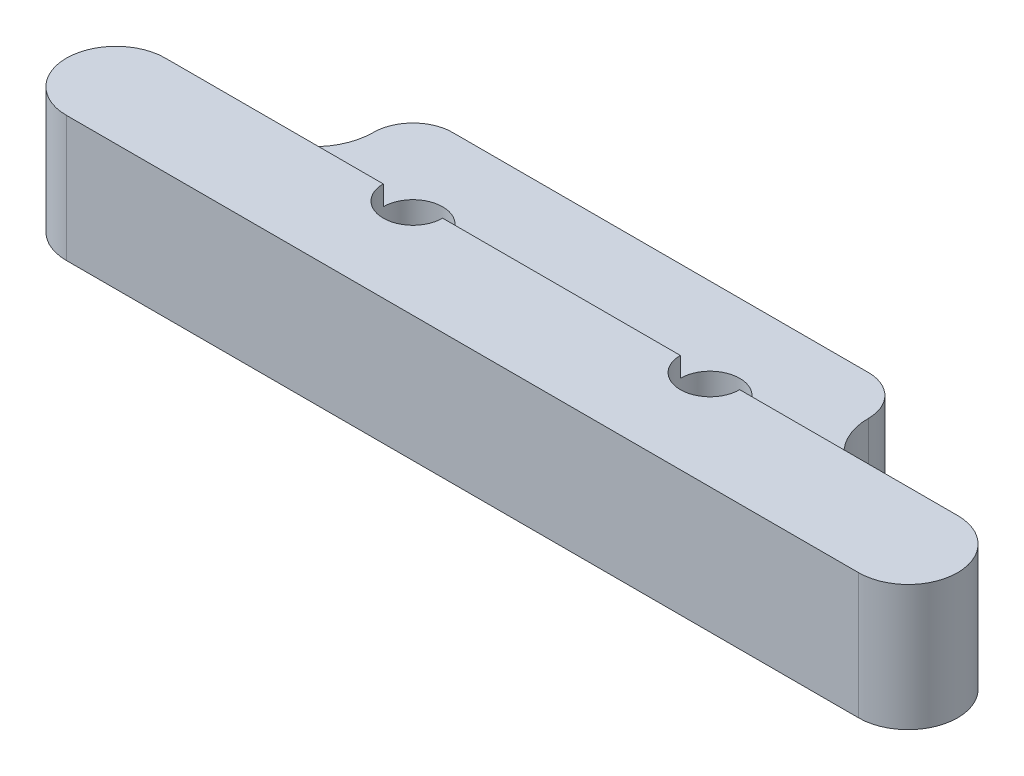
ISO-10303-21;
HEADER;
FILE_DESCRIPTION(('STEP AP214'),'2;1');
FILE_NAME('part.step','',(''),(''),'','','');
FILE_SCHEMA(('AUTOMOTIVE_DESIGN { 1 0 10303 214 1 1 1 1 }'));
ENDSEC;
DATA;
#1=APPLICATION_CONTEXT('core data for automotive mechanical design processes');
#2=APPLICATION_PROTOCOL_DEFINITION('international standard','automotive_design',2000,#1);
#3=PRODUCT_CONTEXT('',#1,'mechanical');
#4=PRODUCT('Part','Part','',(#3));
#5=PRODUCT_RELATED_PRODUCT_CATEGORY('part','',(#4));
#6=PRODUCT_DEFINITION_FORMATION('','',#4);
#7=PRODUCT_DEFINITION_CONTEXT('part definition',#1,'design');
#8=PRODUCT_DEFINITION('design','',#6,#7);
#9=PRODUCT_DEFINITION_SHAPE('','',#8);
#10=(LENGTH_UNIT() NAMED_UNIT(*) SI_UNIT(.MILLI.,.METRE.));
#11=(NAMED_UNIT(*) PLANE_ANGLE_UNIT() SI_UNIT($,.RADIAN.));
#12=(NAMED_UNIT(*) SI_UNIT($,.STERADIAN.) SOLID_ANGLE_UNIT());
#13=UNCERTAINTY_MEASURE_WITH_UNIT(LENGTH_MEASURE(1.E-05),#10,'distance_accuracy_value','');
#14=(GEOMETRIC_REPRESENTATION_CONTEXT(3) GLOBAL_UNCERTAINTY_ASSIGNED_CONTEXT((#13)) GLOBAL_UNIT_ASSIGNED_CONTEXT((#10,
#11,#12)) REPRESENTATION_CONTEXT('',''));
#15=CARTESIAN_POINT('',(0.,0.,0.));
#16=DIRECTION('',(0.,0.,1.));
#17=DIRECTION('',(1.,0.,0.));
#18=AXIS2_PLACEMENT_3D('',#15,#16,#17);
#19=CARTESIAN_POINT('',(10.5,6.35,-5.5));
#20=DIRECTION('',(0.,-1.,0.));
#21=DIRECTION('',(0.,0.,-1.));
#22=AXIS2_PLACEMENT_3D('',#19,#20,#21);
#23=CYLINDRICAL_SURFACE('',#22,2.);
#24=DIRECTION('',(0.,-1.,0.));
#25=VECTOR('',#24,1.);
#26=CARTESIAN_POINT('',(10.5,6.35,-7.5));
#27=LINE('',#26,#25);
#28=CARTESIAN_POINT('',(10.5,5.35,-7.5));
#29=VERTEX_POINT('',#28);
#30=CARTESIAN_POINT('',(10.5,0.,-7.5));
#31=VERTEX_POINT('',#30);
#32=EDGE_CURVE('E167',#29,#31,#27,.T.);
#33=ORIENTED_EDGE('',*,*,#32,.F.);
#34=CARTESIAN_POINT('',(10.5,5.35,-5.5));
#35=DIRECTION('',(0.,1.,0.));
#36=DIRECTION('',(0.,0.,1.));
#37=AXIS2_PLACEMENT_3D('',#34,#35,#36);
#38=CIRCLE('',#37,2.);
#39=CARTESIAN_POINT('',(12.5,5.35,-5.5));
#40=VERTEX_POINT('',#39);
#41=EDGE_CURVE('E234',#40,#29,#38,.T.);
#42=ORIENTED_EDGE('',*,*,#41,.F.);
#43=DIRECTION('',(0.,-1.,0.));
#44=VECTOR('',#43,1.);
#45=CARTESIAN_POINT('',(12.5,6.35,-5.5));
#46=LINE('',#45,#44);
#47=CARTESIAN_POINT('',(12.5,0.,-5.5));
#48=VERTEX_POINT('',#47);
#49=EDGE_CURVE('E165',#40,#48,#46,.T.);
#50=ORIENTED_EDGE('',*,*,#49,.T.);
#51=CARTESIAN_POINT('',(10.5,0.,-5.5));
#52=DIRECTION('',(0.,1.,0.));
#53=DIRECTION('',(0.,0.,1.));
#54=AXIS2_PLACEMENT_3D('',#51,#52,#53);
#55=CIRCLE('',#54,2.);
#56=EDGE_CURVE('E189',#31,#48,#55,.F.);
#57=ORIENTED_EDGE('',*,*,#56,.F.);
#58=EDGE_LOOP('',(#33,#42,#50,#57));
#59=FACE_BOUND('',#58,.T.);
#60=ADVANCED_FACE('F36',(#59),#23,.T.);
#61=CARTESIAN_POINT('',(0.,6.35,-7.5));
#62=DIRECTION('',(0.,0.,-1.));
#63=DIRECTION('',(-1.,0.,0.));
#64=AXIS2_PLACEMENT_3D('',#61,#62,#63);
#65=PLANE('',#64);
#66=DIRECTION('',(0.,-1.,0.));
#67=VECTOR('',#66,1.);
#68=CARTESIAN_POINT('',(-10.5,6.35,-7.5));
#69=LINE('',#68,#67);
#70=CARTESIAN_POINT('',(-10.5,5.35,-7.5));
#71=VERTEX_POINT('',#70);
#72=CARTESIAN_POINT('',(-10.5,0.,-7.5));
#73=VERTEX_POINT('',#72);
#74=EDGE_CURVE('E169',#71,#73,#69,.T.);
#75=ORIENTED_EDGE('',*,*,#74,.F.);
#76=DIRECTION('',(-1.,0.,0.));
#77=VECTOR('',#76,1.);
#78=CARTESIAN_POINT('',(0.,5.35,-7.5));
#79=LINE('',#78,#77);
#80=EDGE_CURVE('E232',#29,#71,#79,.T.);
#81=ORIENTED_EDGE('',*,*,#80,.F.);
#82=ORIENTED_EDGE('',*,*,#32,.T.);
#83=DIRECTION('',(1.,0.,0.));
#84=VECTOR('',#83,1.);
#85=CARTESIAN_POINT('',(0.,0.,-7.5));
#86=LINE('',#85,#84);
#87=EDGE_CURVE('E186',#73,#31,#86,.T.);
#88=ORIENTED_EDGE('',*,*,#87,.F.);
#89=EDGE_LOOP('',(#75,#81,#82,#88));
#90=FACE_BOUND('',#89,.T.);
#91=ADVANCED_FACE('F266',(#90),#65,.T.);
#92=CARTESIAN_POINT('',(-10.5,6.35,-5.5));
#93=DIRECTION('',(0.,-1.,0.));
#94=DIRECTION('',(0.,0.,-1.));
#95=AXIS2_PLACEMENT_3D('',#92,#93,#94);
#96=CYLINDRICAL_SURFACE('',#95,2.);
#97=DIRECTION('',(0.,-1.,0.));
#98=VECTOR('',#97,1.);
#99=CARTESIAN_POINT('',(-12.5,6.35,-5.5));
#100=LINE('',#99,#98);
#101=CARTESIAN_POINT('',(-12.5,5.35,-5.5));
#102=VERTEX_POINT('',#101);
#103=CARTESIAN_POINT('',(-12.5,0.,-5.5));
#104=VERTEX_POINT('',#103);
#105=EDGE_CURVE('E171',#102,#104,#100,.T.);
#106=ORIENTED_EDGE('',*,*,#105,.F.);
#107=CARTESIAN_POINT('',(-10.5,5.35,-5.5));
#108=DIRECTION('',(0.,1.,0.));
#109=DIRECTION('',(0.,0.,1.));
#110=AXIS2_PLACEMENT_3D('',#107,#108,#109);
#111=CIRCLE('',#110,2.);
#112=EDGE_CURVE('E51',#71,#102,#111,.T.);
#113=ORIENTED_EDGE('',*,*,#112,.F.);
#114=ORIENTED_EDGE('',*,*,#74,.T.);
#115=CARTESIAN_POINT('',(-10.5,0.,-5.5));
#116=DIRECTION('',(0.,1.,0.));
#117=DIRECTION('',(0.,0.,1.));
#118=AXIS2_PLACEMENT_3D('',#115,#116,#117);
#119=CIRCLE('',#118,2.);
#120=EDGE_CURVE('E183',#104,#73,#119,.F.);
#121=ORIENTED_EDGE('',*,*,#120,.F.);
#122=EDGE_LOOP('',(#106,#113,#114,#121));
#123=FACE_BOUND('',#122,.T.);
#124=ADVANCED_FACE('F269',(#123),#96,.T.);
#125=CARTESIAN_POINT('',(15.5,6.35,-5.5));
#126=DIRECTION('',(0.,1.,0.));
#127=DIRECTION('',(0.,0.,1.));
#128=AXIS2_PLACEMENT_3D('',#125,#126,#127);
#129=CYLINDRICAL_SURFACE('',#128,3.);
#130=CARTESIAN_POINT('',(15.5,5.35,-5.5));
#131=DIRECTION('',(0.,1.,0.));
#132=DIRECTION('',(0.,0.,1.));
#133=AXIS2_PLACEMENT_3D('',#130,#131,#132);
#134=CIRCLE('',#133,3.);
#135=CARTESIAN_POINT('',(15.5,5.35,-2.5));
#136=VERTEX_POINT('',#135);
#137=EDGE_CURVE('E236',#136,#40,#134,.F.);
#138=ORIENTED_EDGE('',*,*,#137,.F.);
#139=DIRECTION('',(0.,-1.,0.));
#140=VECTOR('',#139,1.);
#141=CARTESIAN_POINT('',(15.5,6.35,-2.5));
#142=LINE('',#141,#140);
#143=CARTESIAN_POINT('',(15.5,0.,-2.5));
#144=VERTEX_POINT('',#143);
#145=EDGE_CURVE('E154',#144,#136,#142,.F.);
#146=ORIENTED_EDGE('',*,*,#145,.F.);
#147=CARTESIAN_POINT('',(15.5,0.,-5.5));
#148=DIRECTION('',(0.,1.,0.));
#149=DIRECTION('',(0.,0.,1.));
#150=AXIS2_PLACEMENT_3D('',#147,#148,#149);
#151=CIRCLE('',#150,3.);
#152=EDGE_CURVE('E44',#48,#144,#151,.T.);
#153=ORIENTED_EDGE('',*,*,#152,.F.);
#154=ORIENTED_EDGE('',*,*,#49,.F.);
#155=EDGE_LOOP('',(#138,#146,#153,#154));
#156=FACE_BOUND('',#155,.T.);
#157=ADVANCED_FACE('F251',(#156),#129,.F.);
#158=CARTESIAN_POINT('',(-15.5,6.35,-5.5));
#159=DIRECTION('',(0.,1.,0.));
#160=DIRECTION('',(0.,0.,1.));
#161=AXIS2_PLACEMENT_3D('',#158,#159,#160);
#162=CYLINDRICAL_SURFACE('',#161,3.);
#163=CARTESIAN_POINT('',(-15.5,5.35,-5.5));
#164=DIRECTION('',(0.,1.,0.));
#165=DIRECTION('',(0.,0.,1.));
#166=AXIS2_PLACEMENT_3D('',#163,#164,#165);
#167=CIRCLE('',#166,3.);
#168=CARTESIAN_POINT('',(-15.5,5.35,-2.5));
#169=VERTEX_POINT('',#168);
#170=EDGE_CURVE('E144',#102,#169,#167,.F.);
#171=ORIENTED_EDGE('',*,*,#170,.F.);
#172=ORIENTED_EDGE('',*,*,#105,.T.);
#173=CARTESIAN_POINT('',(-15.5,0.,-5.5));
#174=DIRECTION('',(0.,1.,0.));
#175=DIRECTION('',(0.,0.,1.));
#176=AXIS2_PLACEMENT_3D('',#173,#174,#175);
#177=CIRCLE('',#176,3.);
#178=CARTESIAN_POINT('',(-15.5,0.,-2.5));
#179=VERTEX_POINT('',#178);
#180=EDGE_CURVE('E11',#179,#104,#177,.T.);
#181=ORIENTED_EDGE('',*,*,#180,.F.);
#182=DIRECTION('',(0.,-1.,0.));
#183=VECTOR('',#182,1.);
#184=CARTESIAN_POINT('',(-15.5,0.,-2.5));
#185=LINE('',#184,#183);
#186=EDGE_CURVE('E59',#169,#179,#185,.T.);
#187=ORIENTED_EDGE('',*,*,#186,.F.);
#188=EDGE_LOOP('',(#171,#172,#181,#187));
#189=FACE_BOUND('',#188,.T.);
#190=ADVANCED_FACE('F38',(#189),#162,.F.);
#191=CARTESIAN_POINT('',(0.,6.35,2.5));
#192=DIRECTION('',(0.,0.,-1.));
#193=DIRECTION('',(-1.,0.,0.));
#194=AXIS2_PLACEMENT_3D('',#191,#192,#193);
#195=PLANE('',#194);
#196=DIRECTION('',(1.,0.,0.));
#197=VECTOR('',#196,1.);
#198=CARTESIAN_POINT('',(0.,0.,2.5));
#199=LINE('',#198,#197);
#200=CARTESIAN_POINT('',(-20.,0.,2.5));
#201=VERTEX_POINT('',#200);
#202=CARTESIAN_POINT('',(20.,0.,2.5));
#203=VERTEX_POINT('',#202);
#204=EDGE_CURVE('E197',#201,#203,#199,.T.);
#205=ORIENTED_EDGE('',*,*,#204,.T.);
#206=DIRECTION('',(0.,-1.,0.));
#207=VECTOR('',#206,1.);
#208=CARTESIAN_POINT('',(20.,6.35,2.5));
#209=LINE('',#208,#207);
#210=CARTESIAN_POINT('',(20.,6.35,2.5));
#211=VERTEX_POINT('',#210);
#212=EDGE_CURVE('E157',#211,#203,#209,.T.);
#213=ORIENTED_EDGE('',*,*,#212,.F.);
#214=DIRECTION('',(1.,0.,0.));
#215=VECTOR('',#214,1.);
#216=CARTESIAN_POINT('',(0.,6.35,2.5));
#217=LINE('',#216,#215);
#218=CARTESIAN_POINT('',(-20.,6.35,2.5));
#219=VERTEX_POINT('',#218);
#220=EDGE_CURVE('E181',#219,#211,#217,.T.);
#221=ORIENTED_EDGE('',*,*,#220,.F.);
#222=DIRECTION('',(0.,-1.,0.));
#223=VECTOR('',#222,1.);
#224=CARTESIAN_POINT('',(-20.,6.35,2.5));
#225=LINE('',#224,#223);
#226=EDGE_CURVE('E175',#219,#201,#225,.T.);
#227=ORIENTED_EDGE('',*,*,#226,.T.);
#228=EDGE_LOOP('',(#205,#213,#221,#227));
#229=FACE_BOUND('',#228,.T.);
#230=ADVANCED_FACE('F294',(#229),#195,.F.);
#231=CARTESIAN_POINT('',(20.,6.35,0.));
#232=DIRECTION('',(0.,-1.,0.));
#233=DIRECTION('',(0.,0.,-1.));
#234=AXIS2_PLACEMENT_3D('',#231,#232,#233);
#235=CYLINDRICAL_SURFACE('',#234,2.5);
#236=CARTESIAN_POINT('',(20.,0.,0.));
#237=DIRECTION('',(0.,1.,0.));
#238=DIRECTION('',(0.,0.,1.));
#239=AXIS2_PLACEMENT_3D('',#236,#237,#238);
#240=CIRCLE('',#239,2.5);
#241=CARTESIAN_POINT('',(20.,0.,-2.5));
#242=VERTEX_POINT('',#241);
#243=EDGE_CURVE('E194',#203,#242,#240,.T.);
#244=ORIENTED_EDGE('',*,*,#243,.T.);
#245=DIRECTION('',(0.,-1.,0.));
#246=VECTOR('',#245,1.);
#247=CARTESIAN_POINT('',(20.,6.35,-2.5));
#248=LINE('',#247,#246);
#249=CARTESIAN_POINT('',(20.,6.35,-2.5));
#250=VERTEX_POINT('',#249);
#251=EDGE_CURVE('E162',#250,#242,#248,.T.);
#252=ORIENTED_EDGE('',*,*,#251,.F.);
#253=CARTESIAN_POINT('',(20.,6.35,0.));
#254=DIRECTION('',(0.,1.,0.));
#255=DIRECTION('',(0.,0.,1.));
#256=AXIS2_PLACEMENT_3D('',#253,#254,#255);
#257=CIRCLE('',#256,2.5);
#258=EDGE_CURVE('E205',#211,#250,#257,.T.);
#259=ORIENTED_EDGE('',*,*,#258,.F.);
#260=ORIENTED_EDGE('',*,*,#212,.T.);
#261=EDGE_LOOP('',(#244,#252,#259,#260));
#262=FACE_BOUND('',#261,.T.);
#263=ADVANCED_FACE('F292',(#262),#235,.T.);
#264=CARTESIAN_POINT('',(0.,6.35,-2.5));
#265=DIRECTION('',(0.,0.,-1.));
#266=DIRECTION('',(-1.,0.,0.));
#267=AXIS2_PLACEMENT_3D('',#264,#265,#266);
#268=PLANE('',#267);
#269=DIRECTION('',(1.,0.,0.));
#270=VECTOR('',#269,1.);
#271=CARTESIAN_POINT('',(0.,0.,-2.5));
#272=LINE('',#271,#270);
#273=EDGE_CURVE('E192',#144,#242,#272,.T.);
#274=ORIENTED_EDGE('',*,*,#273,.F.);
#275=ORIENTED_EDGE('',*,*,#145,.T.);
#276=DIRECTION('',(1.,0.,0.));
#277=VECTOR('',#276,1.);
#278=CARTESIAN_POINT('',(0.,5.35,-2.5));
#279=LINE('',#278,#277);
#280=CARTESIAN_POINT('',(9.,5.35,-2.5));
#281=VERTEX_POINT('',#280);
#282=EDGE_CURVE('E146',#281,#136,#279,.T.);
#283=ORIENTED_EDGE('',*,*,#282,.F.);
#284=DIRECTION('',(0.,1.,0.));
#285=VECTOR('',#284,1.);
#286=CARTESIAN_POINT('',(9.,5.35,-2.5));
#287=LINE('',#286,#285);
#288=CARTESIAN_POINT('',(9.,6.35,-2.5));
#289=VERTEX_POINT('',#288);
#290=EDGE_CURVE('E221',#281,#289,#287,.T.);
#291=ORIENTED_EDGE('',*,*,#290,.T.);
#292=DIRECTION('',(1.,0.,0.));
#293=VECTOR('',#292,1.);
#294=CARTESIAN_POINT('',(0.,6.35,-2.5));
#295=LINE('',#294,#293);
#296=EDGE_CURVE('E203',#289,#250,#295,.T.);
#297=ORIENTED_EDGE('',*,*,#296,.T.);
#298=ORIENTED_EDGE('',*,*,#251,.T.);
#299=EDGE_LOOP('',(#274,#275,#283,#291,#297,#298));
#300=FACE_BOUND('',#299,.T.);
#301=ADVANCED_FACE('F254',(#300),#268,.T.);
#302=CARTESIAN_POINT('',(-20.,6.35,-2.5));
#303=VERTEX_POINT('',#302);
#304=CARTESIAN_POINT('',(-9.,6.35,-2.5));
#305=VERTEX_POINT('',#304);
#306=EDGE_CURVE('E202',#303,#305,#295,.T.);
#307=ORIENTED_EDGE('',*,*,#306,.T.);
#308=DIRECTION('',(0.,1.,0.));
#309=VECTOR('',#308,1.);
#310=CARTESIAN_POINT('',(-9.,5.35,-2.5));
#311=LINE('',#310,#309);
#312=CARTESIAN_POINT('',(-9.,5.35,-2.5));
#313=VERTEX_POINT('',#312);
#314=EDGE_CURVE('E140',#313,#305,#311,.T.);
#315=ORIENTED_EDGE('',*,*,#314,.F.);
#316=EDGE_CURVE('E137',#169,#313,#279,.T.);
#317=ORIENTED_EDGE('',*,*,#316,.F.);
#318=ORIENTED_EDGE('',*,*,#186,.T.);
#319=CARTESIAN_POINT('',(-20.,0.,-2.5));
#320=VERTEX_POINT('',#319);
#321=EDGE_CURVE('E182',#320,#179,#272,.T.);
#322=ORIENTED_EDGE('',*,*,#321,.F.);
#323=DIRECTION('',(0.,-1.,0.));
#324=VECTOR('',#323,1.);
#325=CARTESIAN_POINT('',(-20.,6.35,-2.5));
#326=LINE('',#325,#324);
#327=EDGE_CURVE('E173',#303,#320,#326,.T.);
#328=ORIENTED_EDGE('',*,*,#327,.F.);
#329=EDGE_LOOP('',(#307,#315,#317,#318,#322,#328));
#330=FACE_BOUND('',#329,.T.);
#331=ADVANCED_FACE('F138',(#330),#268,.T.);
#332=CARTESIAN_POINT('',(-20.,6.35,0.));
#333=DIRECTION('',(0.,-1.,0.));
#334=DIRECTION('',(0.,0.,-1.));
#335=AXIS2_PLACEMENT_3D('',#332,#333,#334);
#336=CYLINDRICAL_SURFACE('',#335,2.5);
#337=CARTESIAN_POINT('',(-20.,0.,0.));
#338=DIRECTION('',(0.,1.,0.));
#339=DIRECTION('',(0.,0.,1.));
#340=AXIS2_PLACEMENT_3D('',#337,#338,#339);
#341=CIRCLE('',#340,2.5);
#342=EDGE_CURVE('E179',#320,#201,#341,.T.);
#343=ORIENTED_EDGE('',*,*,#342,.T.);
#344=ORIENTED_EDGE('',*,*,#226,.F.);
#345=CARTESIAN_POINT('',(-20.,6.35,0.));
#346=DIRECTION('',(0.,1.,0.));
#347=DIRECTION('',(0.,0.,1.));
#348=AXIS2_PLACEMENT_3D('',#345,#346,#347);
#349=CIRCLE('',#348,2.5);
#350=EDGE_CURVE('E178',#303,#219,#349,.T.);
#351=ORIENTED_EDGE('',*,*,#350,.F.);
#352=ORIENTED_EDGE('',*,*,#327,.T.);
#353=EDGE_LOOP('',(#343,#344,#351,#352));
#354=FACE_BOUND('',#353,.T.);
#355=ADVANCED_FACE('F275',(#354),#336,.T.);
#356=CARTESIAN_POINT('',(0.,6.35,0.));
#357=DIRECTION('',(0.,1.,0.));
#358=DIRECTION('',(0.,0.,1.));
#359=AXIS2_PLACEMENT_3D('',#356,#357,#358);
#360=PLANE('',#359);
#361=ORIENTED_EDGE('',*,*,#296,.F.);
#362=CARTESIAN_POINT('',(7.5,6.35,-2.5));
#363=DIRECTION('',(0.,1.,0.));
#364=DIRECTION('',(0.,0.,1.));
#365=AXIS2_PLACEMENT_3D('',#362,#363,#364);
#366=CIRCLE('',#365,1.5);
#367=CARTESIAN_POINT('',(6.,6.35,-2.5));
#368=VERTEX_POINT('',#367);
#369=EDGE_CURVE('E212',#368,#289,#366,.T.);
#370=ORIENTED_EDGE('',*,*,#369,.F.);
#371=DIRECTION('',(1.,0.,0.));
#372=VECTOR('',#371,1.);
#373=CARTESIAN_POINT('',(0.,6.35,-2.5));
#374=LINE('',#373,#372);
#375=CARTESIAN_POINT('',(-6.,6.35,-2.5));
#376=VERTEX_POINT('',#375);
#377=EDGE_CURVE('E151',#376,#368,#374,.T.);
#378=ORIENTED_EDGE('',*,*,#377,.F.);
#379=CARTESIAN_POINT('',(-7.5,6.35,-2.5));
#380=DIRECTION('',(0.,1.,0.));
#381=DIRECTION('',(0.,0.,1.));
#382=AXIS2_PLACEMENT_3D('',#379,#380,#381);
#383=CIRCLE('',#382,1.5);
#384=EDGE_CURVE('E218',#305,#376,#383,.T.);
#385=ORIENTED_EDGE('',*,*,#384,.F.);
#386=ORIENTED_EDGE('',*,*,#306,.F.);
#387=ORIENTED_EDGE('',*,*,#350,.T.);
#388=ORIENTED_EDGE('',*,*,#220,.T.);
#389=ORIENTED_EDGE('',*,*,#258,.T.);
#390=EDGE_LOOP('',(#361,#370,#378,#385,#386,#387,#388,#389));
#391=FACE_BOUND('',#390,.T.);
#392=ADVANCED_FACE('F279',(#391),#360,.T.);
#393=CARTESIAN_POINT('',(0.,0.,0.));
#394=DIRECTION('',(0.,1.,0.));
#395=DIRECTION('',(0.,0.,1.));
#396=AXIS2_PLACEMENT_3D('',#393,#394,#395);
#397=PLANE('',#396);
#398=CARTESIAN_POINT('',(-7.5,0.,-2.5));
#399=DIRECTION('',(0.,1.,0.));
#400=DIRECTION('',(0.,0.,1.));
#401=AXIS2_PLACEMENT_3D('',#398,#399,#400);
#402=CIRCLE('',#401,1.5);
#403=CARTESIAN_POINT('',(-7.5,0.,-1.));
#404=VERTEX_POINT('',#403);
#405=EDGE_CURVE('E215',#404,#404,#402,.T.);
#406=ORIENTED_EDGE('',*,*,#405,.T.);
#407=EDGE_LOOP('',(#406));
#408=FACE_BOUND('',#407,.T.);
#409=CARTESIAN_POINT('',(7.5,0.,-2.5));
#410=DIRECTION('',(0.,1.,0.));
#411=DIRECTION('',(0.,0.,1.));
#412=AXIS2_PLACEMENT_3D('',#409,#410,#411);
#413=CIRCLE('',#412,1.5);
#414=CARTESIAN_POINT('',(7.5,0.,-1.));
#415=VERTEX_POINT('',#414);
#416=EDGE_CURVE('E200',#415,#415,#413,.T.);
#417=ORIENTED_EDGE('',*,*,#416,.T.);
#418=EDGE_LOOP('',(#417));
#419=FACE_BOUND('',#418,.T.);
#420=ORIENTED_EDGE('',*,*,#204,.F.);
#421=ORIENTED_EDGE('',*,*,#342,.F.);
#422=ORIENTED_EDGE('',*,*,#321,.T.);
#423=ORIENTED_EDGE('',*,*,#180,.T.);
#424=ORIENTED_EDGE('',*,*,#120,.T.);
#425=ORIENTED_EDGE('',*,*,#87,.T.);
#426=ORIENTED_EDGE('',*,*,#56,.T.);
#427=ORIENTED_EDGE('',*,*,#152,.T.);
#428=ORIENTED_EDGE('',*,*,#273,.T.);
#429=ORIENTED_EDGE('',*,*,#243,.F.);
#430=EDGE_LOOP('',(#420,#421,#422,#423,#424,#425,#426,#427,#428,#429));
#431=FACE_BOUND('',#430,.T.);
#432=ADVANCED_FACE('F258',(#408,#419,#431),#397,.F.);
#433=CARTESIAN_POINT('',(7.5,6.35,-2.5));
#434=DIRECTION('',(0.,1.,0.));
#435=DIRECTION('',(0.,0.,1.));
#436=AXIS2_PLACEMENT_3D('',#433,#434,#435);
#437=CYLINDRICAL_SURFACE('',#436,1.5);
#438=ORIENTED_EDGE('',*,*,#369,.T.);
#439=ORIENTED_EDGE('',*,*,#290,.F.);
#440=CARTESIAN_POINT('',(7.5,5.35,-2.5));
#441=DIRECTION('',(0.,1.,0.));
#442=DIRECTION('',(0.,0.,1.));
#443=AXIS2_PLACEMENT_3D('',#440,#441,#442);
#444=CIRCLE('',#443,1.5);
#445=CARTESIAN_POINT('',(6.,5.35,-2.5));
#446=VERTEX_POINT('',#445);
#447=EDGE_CURVE('E238',#446,#281,#444,.F.);
#448=ORIENTED_EDGE('',*,*,#447,.F.);
#449=DIRECTION('',(0.,1.,0.));
#450=VECTOR('',#449,1.);
#451=CARTESIAN_POINT('',(6.,5.35,-2.5));
#452=LINE('',#451,#450);
#453=EDGE_CURVE('E225',#446,#368,#452,.T.);
#454=ORIENTED_EDGE('',*,*,#453,.T.);
#455=EDGE_LOOP('',(#438,#439,#448,#454));
#456=FACE_BOUND('',#455,.T.);
#457=ORIENTED_EDGE('',*,*,#416,.F.);
#458=EDGE_LOOP('',(#457));
#459=FACE_BOUND('',#458,.T.);
#460=ADVANCED_FACE('F288',(#456,#459),#437,.F.);
#461=CARTESIAN_POINT('',(-7.5,6.35,-2.5));
#462=DIRECTION('',(0.,1.,0.));
#463=DIRECTION('',(0.,0.,1.));
#464=AXIS2_PLACEMENT_3D('',#461,#462,#463);
#465=CYLINDRICAL_SURFACE('',#464,1.5);
#466=ORIENTED_EDGE('',*,*,#384,.T.);
#467=DIRECTION('',(0.,1.,0.));
#468=VECTOR('',#467,1.);
#469=CARTESIAN_POINT('',(-6.,5.35,-2.5));
#470=LINE('',#469,#468);
#471=CARTESIAN_POINT('',(-6.,5.35,-2.5));
#472=VERTEX_POINT('',#471);
#473=EDGE_CURVE('E223',#472,#376,#470,.T.);
#474=ORIENTED_EDGE('',*,*,#473,.F.);
#475=CARTESIAN_POINT('',(-7.5,5.35,-2.5));
#476=DIRECTION('',(0.,1.,0.));
#477=DIRECTION('',(0.,0.,1.));
#478=AXIS2_PLACEMENT_3D('',#475,#476,#477);
#479=CIRCLE('',#478,1.5);
#480=EDGE_CURVE('E143',#313,#472,#479,.F.);
#481=ORIENTED_EDGE('',*,*,#480,.F.);
#482=ORIENTED_EDGE('',*,*,#314,.T.);
#483=EDGE_LOOP('',(#466,#474,#481,#482));
#484=FACE_BOUND('',#483,.T.);
#485=ORIENTED_EDGE('',*,*,#405,.F.);
#486=EDGE_LOOP('',(#485));
#487=FACE_BOUND('',#486,.T.);
#488=ADVANCED_FACE('F283',(#484,#487),#465,.F.);
#489=CARTESIAN_POINT('',(0.,5.35,-2.5));
#490=DIRECTION('',(0.,0.,1.));
#491=DIRECTION('',(1.,0.,0.));
#492=AXIS2_PLACEMENT_3D('',#489,#490,#491);
#493=PLANE('',#492);
#494=ORIENTED_EDGE('',*,*,#377,.T.);
#495=ORIENTED_EDGE('',*,*,#453,.F.);
#496=EDGE_CURVE('E147',#472,#446,#279,.T.);
#497=ORIENTED_EDGE('',*,*,#496,.F.);
#498=ORIENTED_EDGE('',*,*,#473,.T.);
#499=EDGE_LOOP('',(#494,#495,#497,#498));
#500=FACE_BOUND('',#499,.T.);
#501=ADVANCED_FACE('F286',(#500),#493,.F.);
#502=CARTESIAN_POINT('',(0.,5.35,0.));
#503=DIRECTION('',(0.,1.,0.));
#504=DIRECTION('',(0.,0.,1.));
#505=AXIS2_PLACEMENT_3D('',#502,#503,#504);
#506=PLANE('',#505);
#507=ORIENTED_EDGE('',*,*,#170,.T.);
#508=ORIENTED_EDGE('',*,*,#316,.T.);
#509=ORIENTED_EDGE('',*,*,#480,.T.);
#510=ORIENTED_EDGE('',*,*,#496,.T.);
#511=ORIENTED_EDGE('',*,*,#447,.T.);
#512=ORIENTED_EDGE('',*,*,#282,.T.);
#513=ORIENTED_EDGE('',*,*,#137,.T.);
#514=ORIENTED_EDGE('',*,*,#41,.T.);
#515=ORIENTED_EDGE('',*,*,#80,.T.);
#516=ORIENTED_EDGE('',*,*,#112,.T.);
#517=EDGE_LOOP('',(#507,#508,#509,#510,#511,#512,#513,#514,#515,#516));
#518=FACE_BOUND('',#517,.T.);
#519=ADVANCED_FACE('F148',(#518),#506,.T.);
#520=CLOSED_SHELL('',(#60,#91,#124,#157,#190,#230,#263,#301,#331,#355,#392,#432,#460,#488,#501,#519));
#521=MANIFOLD_SOLID_BREP('B2',#520);
#522=ADVANCED_BREP_SHAPE_REPRESENTATION('',(#18,#521),#14);
#523=SHAPE_DEFINITION_REPRESENTATION(#9,#522);
ENDSEC;
END-ISO-10303-21;
